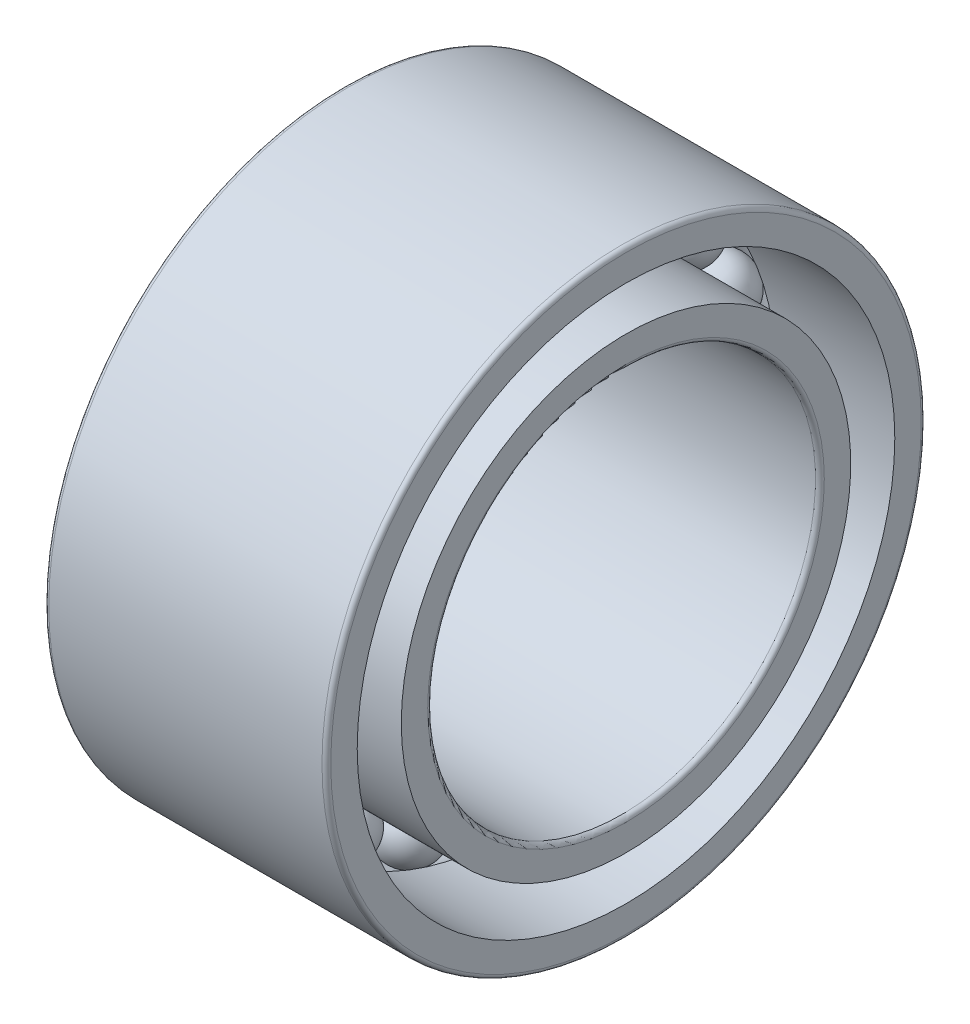
ISO-10303-21;
HEADER;
FILE_DESCRIPTION(('STEP AP214'),'2;1');
FILE_NAME('part.step','',(''),(''),'','','');
FILE_SCHEMA(('AUTOMOTIVE_DESIGN { 1 0 10303 214 1 1 1 1 }'));
ENDSEC;
DATA;
#1=APPLICATION_CONTEXT('core data for automotive mechanical design processes');
#2=APPLICATION_PROTOCOL_DEFINITION('international standard','automotive_design',2000,#1);
#3=PRODUCT_CONTEXT('',#1,'mechanical');
#4=PRODUCT('Part','Part','',(#3));
#5=PRODUCT_RELATED_PRODUCT_CATEGORY('part','',(#4));
#6=PRODUCT_DEFINITION_FORMATION('','',#4);
#7=PRODUCT_DEFINITION_CONTEXT('part definition',#1,'design');
#8=PRODUCT_DEFINITION('design','',#6,#7);
#9=PRODUCT_DEFINITION_SHAPE('','',#8);
#10=(LENGTH_UNIT() NAMED_UNIT(*) SI_UNIT(.MILLI.,.METRE.));
#11=(NAMED_UNIT(*) PLANE_ANGLE_UNIT() SI_UNIT($,.RADIAN.));
#12=(NAMED_UNIT(*) SI_UNIT($,.STERADIAN.) SOLID_ANGLE_UNIT());
#13=UNCERTAINTY_MEASURE_WITH_UNIT(LENGTH_MEASURE(1.E-05),#10,'distance_accuracy_value','');
#14=(GEOMETRIC_REPRESENTATION_CONTEXT(3) GLOBAL_UNCERTAINTY_ASSIGNED_CONTEXT((#13)) GLOBAL_UNIT_ASSIGNED_CONTEXT((#10,
#11,#12)) REPRESENTATION_CONTEXT('',''));
#15=CARTESIAN_POINT('',(0.,0.,0.));
#16=DIRECTION('',(0.,0.,1.));
#17=DIRECTION('',(1.,0.,0.));
#18=AXIS2_PLACEMENT_3D('',#15,#16,#17);
#19=CARTESIAN_POINT('',(0.,13.3147912281322,4.32623792124909));
#20=DIRECTION('',(-1.,0.,0.));
#21=DIRECTION('',(0.,0.951056516295158,0.309016994374935));
#22=AXIS2_PLACEMENT_3D('',#19,#20,#21);
#23=SPHERICAL_SURFACE('',#22,1.75);
#24=CARTESIAN_POINT('',(-1.75,13.3147912281322,4.32623792124909));
#25=VERTEX_POINT('',#24);
#26=VERTEX_LOOP('',#25);
#27=FACE_BOUND('',#26,.T.);
#28=ADVANCED_FACE('F48',(#27),#23,.T.);
#29=CLOSED_SHELL('',(#28));
#30=MANIFOLD_SOLID_BREP('B2',#29);
#31=CARTESIAN_POINT('',(0.,11.3262379212494,8.22899353209447));
#32=DIRECTION('',(-1.,0.,0.));
#33=DIRECTION('',(0.,0.809016994374955,0.587785252292462));
#34=AXIS2_PLACEMENT_3D('',#31,#32,#33);
#35=SPHERICAL_SURFACE('',#34,1.75);
#36=CARTESIAN_POINT('',(-1.75,11.3262379212494,8.22899353209447));
#37=VERTEX_POINT('',#36);
#38=VERTEX_LOOP('',#37);
#39=FACE_BOUND('',#38,.T.);
#40=ADVANCED_FACE('F69',(#39),#35,.T.);
#41=CLOSED_SHELL('',(#40));
#42=MANIFOLD_SOLID_BREP('B6',#41);
#43=CARTESIAN_POINT('',(0.,8.22899353209476,11.3262379212492));
#44=DIRECTION('',(-1.,0.,0.));
#45=DIRECTION('',(0.,0.587785252292483,0.80901699437494));
#46=AXIS2_PLACEMENT_3D('',#43,#44,#45);
#47=SPHERICAL_SURFACE('',#46,1.75);
#48=CARTESIAN_POINT('',(-1.75,8.22899353209476,11.3262379212492));
#49=VERTEX_POINT('',#48);
#50=VERTEX_LOOP('',#49);
#51=FACE_BOUND('',#50,.T.);
#52=ADVANCED_FACE('F90',(#51),#47,.T.);
#53=CLOSED_SHELL('',(#52));
#54=MANIFOLD_SOLID_BREP('B44',#53);
#55=CARTESIAN_POINT('',(0.,4.32623792124942,13.3147912281321));
#56=DIRECTION('',(-1.,0.,0.));
#57=DIRECTION('',(0.,0.309016994374958,0.95105651629515));
#58=AXIS2_PLACEMENT_3D('',#55,#56,#57);
#59=SPHERICAL_SURFACE('',#58,1.75);
#60=CARTESIAN_POINT('',(-1.75,4.32623792124942,13.3147912281321));
#61=VERTEX_POINT('',#60);
#62=VERTEX_LOOP('',#61);
#63=FACE_BOUND('',#62,.T.);
#64=ADVANCED_FACE('F111',(#63),#59,.T.);
#65=CLOSED_SHELL('',(#64));
#66=MANIFOLD_SOLID_BREP('B65',#65);
#67=CARTESIAN_POINT('',(0.,1.46642216231412E-13,14.));
#68=DIRECTION('',(-1.,0.,0.));
#69=DIRECTION('',(0.,0.,1.));
#70=AXIS2_PLACEMENT_3D('',#67,#68,#69);
#71=SPHERICAL_SURFACE('',#70,1.75);
#72=CARTESIAN_POINT('',(-1.75,1.46642216231412E-13,14.));
#73=VERTEX_POINT('',#72);
#74=VERTEX_LOOP('',#73);
#75=FACE_BOUND('',#74,.T.);
#76=ADVANCED_FACE('F132',(#75),#71,.T.);
#77=CLOSED_SHELL('',(#76));
#78=MANIFOLD_SOLID_BREP('B86',#77);
#79=CARTESIAN_POINT('',(0.,-4.32623792124914,13.3147912281322));
#80=DIRECTION('',(-1.,0.,0.));
#81=DIRECTION('',(0.,-0.309016994374938,0.951056516295157));
#82=AXIS2_PLACEMENT_3D('',#79,#80,#81);
#83=SPHERICAL_SURFACE('',#82,1.75);
#84=CARTESIAN_POINT('',(-1.75,-4.32623792124914,13.3147912281322));
#85=VERTEX_POINT('',#84);
#86=VERTEX_LOOP('',#85);
#87=FACE_BOUND('',#86,.T.);
#88=ADVANCED_FACE('F153',(#87),#83,.T.);
#89=CLOSED_SHELL('',(#88));
#90=MANIFOLD_SOLID_BREP('B107',#89);
#91=CARTESIAN_POINT('',(0.,-8.22899353209452,11.3262379212493));
#92=DIRECTION('',(-1.,0.,0.));
#93=DIRECTION('',(0.,-0.587785252292465,0.809016994374953));
#94=AXIS2_PLACEMENT_3D('',#91,#92,#93);
#95=SPHERICAL_SURFACE('',#94,1.75);
#96=CARTESIAN_POINT('',(-1.75,-8.22899353209452,11.3262379212493));
#97=VERTEX_POINT('',#96);
#98=VERTEX_LOOP('',#97);
#99=FACE_BOUND('',#98,.T.);
#100=ADVANCED_FACE('F174',(#99),#95,.T.);
#101=CLOSED_SHELL('',(#100));
#102=MANIFOLD_SOLID_BREP('B128',#101);
#103=CARTESIAN_POINT('',(0.,-11.3262379212492,8.22899353209472));
#104=DIRECTION('',(-1.,0.,0.));
#105=DIRECTION('',(0.,-0.809016994374942,0.58778525229248));
#106=AXIS2_PLACEMENT_3D('',#103,#104,#105);
#107=SPHERICAL_SURFACE('',#106,1.75);
#108=CARTESIAN_POINT('',(-1.75,-11.3262379212492,8.22899353209472));
#109=VERTEX_POINT('',#108);
#110=VERTEX_LOOP('',#109);
#111=FACE_BOUND('',#110,.T.);
#112=ADVANCED_FACE('F195',(#111),#107,.T.);
#113=CLOSED_SHELL('',(#112));
#114=MANIFOLD_SOLID_BREP('B149',#113);
#115=CARTESIAN_POINT('',(0.,-13.3147912281321,4.32623792124937));
#116=DIRECTION('',(-1.,0.,0.));
#117=DIRECTION('',(0.,-0.951056516295151,0.309016994374955));
#118=AXIS2_PLACEMENT_3D('',#115,#116,#117);
#119=SPHERICAL_SURFACE('',#118,1.75);
#120=CARTESIAN_POINT('',(-1.75,-13.3147912281321,4.32623792124937));
#121=VERTEX_POINT('',#120);
#122=VERTEX_LOOP('',#121);
#123=FACE_BOUND('',#122,.T.);
#124=ADVANCED_FACE('F216',(#123),#119,.T.);
#125=CLOSED_SHELL('',(#124));
#126=MANIFOLD_SOLID_BREP('B170',#125);
#127=CARTESIAN_POINT('',(0.,-14.,0.));
#128=DIRECTION('',(-1.,0.,0.));
#129=DIRECTION('',(0.,-1.,0.));
#130=AXIS2_PLACEMENT_3D('',#127,#128,#129);
#131=SPHERICAL_SURFACE('',#130,1.75);
#132=CARTESIAN_POINT('',(-1.75,-14.,0.));
#133=VERTEX_POINT('',#132);
#134=VERTEX_LOOP('',#133);
#135=FACE_BOUND('',#134,.T.);
#136=ADVANCED_FACE('F237',(#135),#131,.T.);
#137=CLOSED_SHELL('',(#136));
#138=MANIFOLD_SOLID_BREP('B191',#137);
#139=CARTESIAN_POINT('',(0.,-13.3147912281322,-4.32623792124918));
#140=DIRECTION('',(-1.,0.,0.));
#141=DIRECTION('',(0.,-0.951056516295156,-0.309016994374941));
#142=AXIS2_PLACEMENT_3D('',#139,#140,#141);
#143=SPHERICAL_SURFACE('',#142,1.75);
#144=CARTESIAN_POINT('',(-1.75,-13.3147912281322,-4.32623792124918));
#145=VERTEX_POINT('',#144);
#146=VERTEX_LOOP('',#145);
#147=FACE_BOUND('',#146,.T.);
#148=ADVANCED_FACE('F258',(#147),#143,.T.);
#149=CLOSED_SHELL('',(#148));
#150=MANIFOLD_SOLID_BREP('B212',#149);
#151=CARTESIAN_POINT('',(0.,-11.3262379212493,-8.22899353209456));
#152=DIRECTION('',(-1.,0.,0.));
#153=DIRECTION('',(0.,-0.809016994374951,-0.587785252292469));
#154=AXIS2_PLACEMENT_3D('',#151,#152,#153);
#155=SPHERICAL_SURFACE('',#154,1.75);
#156=CARTESIAN_POINT('',(-1.75,-11.3262379212493,-8.22899353209456));
#157=VERTEX_POINT('',#156);
#158=VERTEX_LOOP('',#157);
#159=FACE_BOUND('',#158,.T.);
#160=ADVANCED_FACE('F279',(#159),#155,.T.);
#161=CLOSED_SHELL('',(#160));
#162=MANIFOLD_SOLID_BREP('B233',#161);
#163=CARTESIAN_POINT('',(0.,-8.22899353209468,-11.3262379212492));
#164=DIRECTION('',(-1.,0.,0.));
#165=DIRECTION('',(0.,-0.587785252292477,-0.809016994374945));
#166=AXIS2_PLACEMENT_3D('',#163,#164,#165);
#167=SPHERICAL_SURFACE('',#166,1.75);
#168=CARTESIAN_POINT('',(-1.75,-8.22899353209468,-11.3262379212492));
#169=VERTEX_POINT('',#168);
#170=VERTEX_LOOP('',#169);
#171=FACE_BOUND('',#170,.T.);
#172=ADVANCED_FACE('F300',(#171),#167,.T.);
#173=CLOSED_SHELL('',(#172));
#174=MANIFOLD_SOLID_BREP('B254',#173);
#175=CARTESIAN_POINT('',(0.,-4.32623792124932,-13.3147912281321));
#176=DIRECTION('',(-1.,0.,0.));
#177=DIRECTION('',(0.,-0.309016994374952,-0.951056516295152));
#178=AXIS2_PLACEMENT_3D('',#175,#176,#177);
#179=SPHERICAL_SURFACE('',#178,1.75);
#180=CARTESIAN_POINT('',(-1.75,-4.32623792124932,-13.3147912281321));
#181=VERTEX_POINT('',#180);
#182=VERTEX_LOOP('',#181);
#183=FACE_BOUND('',#182,.T.);
#184=ADVANCED_FACE('F321',(#183),#179,.T.);
#185=CLOSED_SHELL('',(#184));
#186=MANIFOLD_SOLID_BREP('B275',#185);
#187=CARTESIAN_POINT('',(0.,0.,-14.));
#188=DIRECTION('',(-1.,0.,0.));
#189=DIRECTION('',(0.,0.,-1.));
#190=AXIS2_PLACEMENT_3D('',#187,#188,#189);
#191=SPHERICAL_SURFACE('',#190,1.75);
#192=CARTESIAN_POINT('',(-1.75,0.,-14.));
#193=VERTEX_POINT('',#192);
#194=VERTEX_LOOP('',#193);
#195=FACE_BOUND('',#194,.T.);
#196=ADVANCED_FACE('F342',(#195),#191,.T.);
#197=CLOSED_SHELL('',(#196));
#198=MANIFOLD_SOLID_BREP('B296',#197);
#199=CARTESIAN_POINT('',(0.,4.32623792124923,-13.3147912281322));
#200=DIRECTION('',(-1.,0.,0.));
#201=DIRECTION('',(0.,0.309016994374945,-0.951056516295155));
#202=AXIS2_PLACEMENT_3D('',#199,#200,#201);
#203=SPHERICAL_SURFACE('',#202,1.75);
#204=CARTESIAN_POINT('',(-1.75,4.32623792124923,-13.3147912281322));
#205=VERTEX_POINT('',#204);
#206=VERTEX_LOOP('',#205);
#207=FACE_BOUND('',#206,.T.);
#208=ADVANCED_FACE('F363',(#207),#203,.T.);
#209=CLOSED_SHELL('',(#208));
#210=MANIFOLD_SOLID_BREP('B317',#209);
#211=CARTESIAN_POINT('',(0.,8.2289935320946,-11.3262379212493));
#212=DIRECTION('',(-1.,0.,0.));
#213=DIRECTION('',(0.,0.587785252292471,-0.809016994374949));
#214=AXIS2_PLACEMENT_3D('',#211,#212,#213);
#215=SPHERICAL_SURFACE('',#214,1.75);
#216=CARTESIAN_POINT('',(-1.75,8.2289935320946,-11.3262379212493));
#217=VERTEX_POINT('',#216);
#218=VERTEX_LOOP('',#217);
#219=FACE_BOUND('',#218,.T.);
#220=ADVANCED_FACE('F384',(#219),#215,.T.);
#221=CLOSED_SHELL('',(#220));
#222=MANIFOLD_SOLID_BREP('B338',#221);
#223=CARTESIAN_POINT('',(0.,11.3262379212493,-8.22899353209464));
#224=DIRECTION('',(-1.,0.,0.));
#225=DIRECTION('',(0.,0.809016994374947,-0.587785252292474));
#226=AXIS2_PLACEMENT_3D('',#223,#224,#225);
#227=SPHERICAL_SURFACE('',#226,1.75);
#228=CARTESIAN_POINT('',(-1.75,11.3262379212493,-8.22899353209464));
#229=VERTEX_POINT('',#228);
#230=VERTEX_LOOP('',#229);
#231=FACE_BOUND('',#230,.T.);
#232=ADVANCED_FACE('F405',(#231),#227,.T.);
#233=CLOSED_SHELL('',(#232));
#234=MANIFOLD_SOLID_BREP('B359',#233);
#235=CARTESIAN_POINT('',(0.,13.3147912281321,-4.32623792124927));
#236=DIRECTION('',(-1.,0.,0.));
#237=DIRECTION('',(0.,0.951056516295154,-0.309016994374948));
#238=AXIS2_PLACEMENT_3D('',#235,#236,#237);
#239=SPHERICAL_SURFACE('',#238,1.75);
#240=CARTESIAN_POINT('',(-1.75,13.3147912281321,-4.32623792124927));
#241=VERTEX_POINT('',#240);
#242=VERTEX_LOOP('',#241);
#243=FACE_BOUND('',#242,.T.);
#244=ADVANCED_FACE('F426',(#243),#239,.T.);
#245=CLOSED_SHELL('',(#244));
#246=MANIFOLD_SOLID_BREP('B380',#245);
#247=CARTESIAN_POINT('',(0.,14.,0.));
#248=DIRECTION('',(-1.,0.,0.));
#249=DIRECTION('',(0.,1.,0.));
#250=AXIS2_PLACEMENT_3D('',#247,#248,#249);
#251=SPHERICAL_SURFACE('',#250,1.75);
#252=CARTESIAN_POINT('',(-1.75,14.,0.));
#253=VERTEX_POINT('',#252);
#254=VERTEX_LOOP('',#253);
#255=FACE_BOUND('',#254,.T.);
#256=ADVANCED_FACE('F449',(#255),#251,.T.);
#257=CLOSED_SHELL('',(#256));
#258=MANIFOLD_SOLID_BREP('B401',#257);
#259=CARTESIAN_POINT('',(-7.75,0.,0.));
#260=DIRECTION('',(-1.,0.,0.));
#261=DIRECTION('',(0.,0.,1.));
#262=AXIS2_PLACEMENT_3D('',#259,#260,#261);
#263=TOROIDAL_SURFACE('',#262,11.25,0.250000000000006);
#264=CARTESIAN_POINT('',(-7.75,0.,0.));
#265=DIRECTION('',(-1.,0.,0.));
#266=DIRECTION('',(0.,0.,1.));
#267=AXIS2_PLACEMENT_3D('',#264,#265,#266);
#268=CIRCLE('',#267,11.);
#269=CARTESIAN_POINT('',(-7.75,0.,11.));
#270=VERTEX_POINT('',#269);
#271=EDGE_CURVE('E499',#270,#270,#268,.T.);
#272=ORIENTED_EDGE('',*,*,#271,.F.);
#273=EDGE_LOOP('',(#272));
#274=FACE_BOUND('',#273,.T.);
#275=CARTESIAN_POINT('',(-8.,0.,0.));
#276=DIRECTION('',(-1.,0.,0.));
#277=DIRECTION('',(0.,0.,1.));
#278=AXIS2_PLACEMENT_3D('',#275,#276,#277);
#279=CIRCLE('',#278,11.25);
#280=CARTESIAN_POINT('',(-8.,0.,11.25));
#281=VERTEX_POINT('',#280);
#282=EDGE_CURVE('E448',#281,#281,#279,.T.);
#283=ORIENTED_EDGE('',*,*,#282,.T.);
#284=EDGE_LOOP('',(#283));
#285=FACE_BOUND('',#284,.T.);
#286=ADVANCED_FACE('F471',(#274,#285),#263,.T.);
#287=CARTESIAN_POINT('',(-8.,11.25,0.));
#288=DIRECTION('',(1.,0.,0.));
#289=DIRECTION('',(0.,0.,-1.));
#290=AXIS2_PLACEMENT_3D('',#287,#288,#289);
#291=PLANE('',#290);
#292=ORIENTED_EDGE('',*,*,#282,.F.);
#293=EDGE_LOOP('',(#292));
#294=FACE_BOUND('',#293,.T.);
#295=CARTESIAN_POINT('',(-8.,0.,0.));
#296=DIRECTION('',(-1.,0.,0.));
#297=DIRECTION('',(0.,0.,1.));
#298=AXIS2_PLACEMENT_3D('',#295,#296,#297);
#299=CIRCLE('',#298,12.75);
#300=CARTESIAN_POINT('',(-8.,0.,12.75));
#301=VERTEX_POINT('',#300);
#302=EDGE_CURVE('E477',#301,#301,#299,.T.);
#303=ORIENTED_EDGE('',*,*,#302,.T.);
#304=EDGE_LOOP('',(#303));
#305=FACE_BOUND('',#304,.T.);
#306=ADVANCED_FACE('F506',(#294,#305),#291,.F.);
#307=CARTESIAN_POINT('',(0.,0.,0.));
#308=DIRECTION('',(-1.,0.,0.));
#309=DIRECTION('',(0.,0.,1.));
#310=AXIS2_PLACEMENT_3D('',#307,#308,#309);
#311=CYLINDRICAL_SURFACE('',#310,12.75);
#312=ORIENTED_EDGE('',*,*,#302,.F.);
#313=EDGE_LOOP('',(#312));
#314=FACE_BOUND('',#313,.T.);
#315=CARTESIAN_POINT('',(-1.22474487139159,0.,0.));
#316=DIRECTION('',(-1.,0.,0.));
#317=DIRECTION('',(0.,0.,1.));
#318=AXIS2_PLACEMENT_3D('',#315,#316,#317);
#319=CIRCLE('',#318,12.75);
#320=CARTESIAN_POINT('',(-1.22474487139159,0.,12.75));
#321=VERTEX_POINT('',#320);
#322=EDGE_CURVE('E481',#321,#321,#319,.T.);
#323=ORIENTED_EDGE('',*,*,#322,.T.);
#324=EDGE_LOOP('',(#323));
#325=FACE_BOUND('',#324,.T.);
#326=ADVANCED_FACE('F510',(#314,#325),#311,.T.);
#327=CARTESIAN_POINT('',(0.,0.,0.));
#328=DIRECTION('',(-1.,0.,0.));
#329=DIRECTION('',(0.,0.,1.));
#330=AXIS2_PLACEMENT_3D('',#327,#328,#329);
#331=TOROIDAL_SURFACE('',#330,14.,1.75);
#332=ORIENTED_EDGE('',*,*,#322,.F.);
#333=EDGE_LOOP('',(#332));
#334=FACE_BOUND('',#333,.T.);
#335=CARTESIAN_POINT('',(1.22474487139159,0.,0.));
#336=DIRECTION('',(-1.,0.,0.));
#337=DIRECTION('',(0.,0.,1.));
#338=AXIS2_PLACEMENT_3D('',#335,#336,#337);
#339=CIRCLE('',#338,12.75);
#340=CARTESIAN_POINT('',(1.22474487139159,0.,12.75));
#341=VERTEX_POINT('',#340);
#342=EDGE_CURVE('E485',#341,#341,#339,.T.);
#343=ORIENTED_EDGE('',*,*,#342,.T.);
#344=EDGE_LOOP('',(#343));
#345=FACE_BOUND('',#344,.T.);
#346=ADVANCED_FACE('F515',(#334,#345),#331,.F.);
#347=CARTESIAN_POINT('',(0.,0.,0.));
#348=DIRECTION('',(-1.,0.,0.));
#349=DIRECTION('',(0.,0.,1.));
#350=AXIS2_PLACEMENT_3D('',#347,#348,#349);
#351=CYLINDRICAL_SURFACE('',#350,12.75);
#352=ORIENTED_EDGE('',*,*,#342,.F.);
#353=EDGE_LOOP('',(#352));
#354=FACE_BOUND('',#353,.T.);
#355=CARTESIAN_POINT('',(8.,0.,0.));
#356=DIRECTION('',(-1.,0.,0.));
#357=DIRECTION('',(0.,0.,1.));
#358=AXIS2_PLACEMENT_3D('',#355,#356,#357);
#359=CIRCLE('',#358,12.75);
#360=CARTESIAN_POINT('',(8.,0.,12.75));
#361=VERTEX_POINT('',#360);
#362=EDGE_CURVE('E490',#361,#361,#359,.T.);
#363=ORIENTED_EDGE('',*,*,#362,.T.);
#364=EDGE_LOOP('',(#363));
#365=FACE_BOUND('',#364,.T.);
#366=ADVANCED_FACE('F521',(#354,#365),#351,.T.);
#367=CARTESIAN_POINT('',(8.,12.75,0.));
#368=DIRECTION('',(-1.,0.,0.));
#369=DIRECTION('',(0.,0.,1.));
#370=AXIS2_PLACEMENT_3D('',#367,#368,#369);
#371=PLANE('',#370);
#372=ORIENTED_EDGE('',*,*,#362,.F.);
#373=EDGE_LOOP('',(#372));
#374=FACE_BOUND('',#373,.T.);
#375=CARTESIAN_POINT('',(8.00000000000001,0.,0.));
#376=DIRECTION('',(-1.,0.,0.));
#377=DIRECTION('',(0.,0.,1.));
#378=AXIS2_PLACEMENT_3D('',#375,#376,#377);
#379=CIRCLE('',#378,11.25);
#380=CARTESIAN_POINT('',(8.00000000000001,0.,11.25));
#381=VERTEX_POINT('',#380);
#382=EDGE_CURVE('E493',#381,#381,#379,.T.);
#383=ORIENTED_EDGE('',*,*,#382,.T.);
#384=EDGE_LOOP('',(#383));
#385=FACE_BOUND('',#384,.T.);
#386=ADVANCED_FACE('F525',(#374,#385),#371,.F.);
#387=CARTESIAN_POINT('',(7.75,0.,0.));
#388=DIRECTION('',(-1.,0.,0.));
#389=DIRECTION('',(0.,0.,1.));
#390=AXIS2_PLACEMENT_3D('',#387,#388,#389);
#391=TOROIDAL_SURFACE('',#390,11.25,0.250000000000004);
#392=ORIENTED_EDGE('',*,*,#382,.F.);
#393=EDGE_LOOP('',(#392));
#394=FACE_BOUND('',#393,.T.);
#395=CARTESIAN_POINT('',(7.75,0.,0.));
#396=DIRECTION('',(-1.,0.,0.));
#397=DIRECTION('',(0.,0.,1.));
#398=AXIS2_PLACEMENT_3D('',#395,#396,#397);
#399=CIRCLE('',#398,11.);
#400=CARTESIAN_POINT('',(7.75,0.,11.));
#401=VERTEX_POINT('',#400);
#402=EDGE_CURVE('E496',#401,#401,#399,.T.);
#403=ORIENTED_EDGE('',*,*,#402,.T.);
#404=EDGE_LOOP('',(#403));
#405=FACE_BOUND('',#404,.T.);
#406=ADVANCED_FACE('F529',(#394,#405),#391,.T.);
#407=CARTESIAN_POINT('',(0.,0.,0.));
#408=DIRECTION('',(-1.,0.,0.));
#409=DIRECTION('',(0.,0.,1.));
#410=AXIS2_PLACEMENT_3D('',#407,#408,#409);
#411=CYLINDRICAL_SURFACE('',#410,11.);
#412=ORIENTED_EDGE('',*,*,#402,.F.);
#413=EDGE_LOOP('',(#412));
#414=FACE_BOUND('',#413,.T.);
#415=ORIENTED_EDGE('',*,*,#271,.T.);
#416=EDGE_LOOP('',(#415));
#417=FACE_BOUND('',#416,.T.);
#418=ADVANCED_FACE('F503',(#414,#417),#411,.F.);
#419=CLOSED_SHELL('',(#286,#306,#326,#346,#366,#386,#406,#418));
#420=MANIFOLD_SOLID_BREP('B422',#419);
#421=CARTESIAN_POINT('',(0.,0.,0.));
#422=DIRECTION('',(-1.,0.,0.));
#423=DIRECTION('',(0.,0.,1.));
#424=AXIS2_PLACEMENT_3D('',#421,#422,#423);
#425=CYLINDRICAL_SURFACE('',#424,15.25);
#426=CARTESIAN_POINT('',(-1.22474487139159,0.,0.));
#427=DIRECTION('',(-1.,0.,0.));
#428=DIRECTION('',(0.,0.,1.));
#429=AXIS2_PLACEMENT_3D('',#426,#427,#428);
#430=CIRCLE('',#429,15.25);
#431=CARTESIAN_POINT('',(-1.22474487139159,0.,15.25));
#432=VERTEX_POINT('',#431);
#433=EDGE_CURVE('E644',#432,#432,#430,.T.);
#434=ORIENTED_EDGE('',*,*,#433,.F.);
#435=EDGE_LOOP('',(#434));
#436=FACE_BOUND('',#435,.T.);
#437=CARTESIAN_POINT('',(-8.,0.,0.));
#438=DIRECTION('',(-1.,0.,0.));
#439=DIRECTION('',(0.,0.,1.));
#440=AXIS2_PLACEMENT_3D('',#437,#438,#439);
#441=CIRCLE('',#440,15.25);
#442=CARTESIAN_POINT('',(-8.,0.,15.25));
#443=VERTEX_POINT('',#442);
#444=EDGE_CURVE('E470',#443,#443,#441,.T.);
#445=ORIENTED_EDGE('',*,*,#444,.T.);
#446=EDGE_LOOP('',(#445));
#447=FACE_BOUND('',#446,.T.);
#448=ADVANCED_FACE('F609',(#436,#447),#425,.F.);
#449=CARTESIAN_POINT('',(-8.,16.75,0.));
#450=DIRECTION('',(1.,0.,0.));
#451=DIRECTION('',(0.,0.,-1.));
#452=AXIS2_PLACEMENT_3D('',#449,#450,#451);
#453=PLANE('',#452);
#454=ORIENTED_EDGE('',*,*,#444,.F.);
#455=EDGE_LOOP('',(#454));
#456=FACE_BOUND('',#455,.T.);
#457=CARTESIAN_POINT('',(-8.,0.,0.));
#458=DIRECTION('',(-1.,0.,0.));
#459=DIRECTION('',(0.,0.,1.));
#460=AXIS2_PLACEMENT_3D('',#457,#458,#459);
#461=CIRCLE('',#460,16.75);
#462=CARTESIAN_POINT('',(-8.,0.,16.75));
#463=VERTEX_POINT('',#462);
#464=EDGE_CURVE('E616',#463,#463,#461,.T.);
#465=ORIENTED_EDGE('',*,*,#464,.T.);
#466=EDGE_LOOP('',(#465));
#467=FACE_BOUND('',#466,.T.);
#468=ADVANCED_FACE('F652',(#456,#467),#453,.F.);
#469=CARTESIAN_POINT('',(-7.75,0.,0.));
#470=DIRECTION('',(-1.,0.,0.));
#471=DIRECTION('',(0.,0.,1.));
#472=AXIS2_PLACEMENT_3D('',#469,#470,#471);
#473=TOROIDAL_SURFACE('',#472,16.75,0.250000000000005);
#474=ORIENTED_EDGE('',*,*,#464,.F.);
#475=EDGE_LOOP('',(#474));
#476=FACE_BOUND('',#475,.T.);
#477=CARTESIAN_POINT('',(-7.75,0.,0.));
#478=DIRECTION('',(-1.,0.,0.));
#479=DIRECTION('',(0.,0.,1.));
#480=AXIS2_PLACEMENT_3D('',#477,#478,#479);
#481=CIRCLE('',#480,17.);
#482=CARTESIAN_POINT('',(-7.75,0.,17.));
#483=VERTEX_POINT('',#482);
#484=EDGE_CURVE('E621',#483,#483,#481,.T.);
#485=ORIENTED_EDGE('',*,*,#484,.T.);
#486=EDGE_LOOP('',(#485));
#487=FACE_BOUND('',#486,.T.);
#488=ADVANCED_FACE('F656',(#476,#487),#473,.T.);
#489=CARTESIAN_POINT('',(0.,0.,0.));
#490=DIRECTION('',(-1.,0.,0.));
#491=DIRECTION('',(0.,0.,1.));
#492=AXIS2_PLACEMENT_3D('',#489,#490,#491);
#493=CYLINDRICAL_SURFACE('',#492,17.);
#494=ORIENTED_EDGE('',*,*,#484,.F.);
#495=EDGE_LOOP('',(#494));
#496=FACE_BOUND('',#495,.T.);
#497=CARTESIAN_POINT('',(7.75,0.,0.));
#498=DIRECTION('',(-1.,0.,0.));
#499=DIRECTION('',(0.,0.,1.));
#500=AXIS2_PLACEMENT_3D('',#497,#498,#499);
#501=CIRCLE('',#500,17.);
#502=CARTESIAN_POINT('',(7.75,0.,17.));
#503=VERTEX_POINT('',#502);
#504=EDGE_CURVE('E626',#503,#503,#501,.T.);
#505=ORIENTED_EDGE('',*,*,#504,.T.);
#506=EDGE_LOOP('',(#505));
#507=FACE_BOUND('',#506,.T.);
#508=ADVANCED_FACE('F661',(#496,#507),#493,.T.);
#509=CARTESIAN_POINT('',(7.75,0.,0.));
#510=DIRECTION('',(-1.,0.,0.));
#511=DIRECTION('',(0.,0.,1.));
#512=AXIS2_PLACEMENT_3D('',#509,#510,#511);
#513=TOROIDAL_SURFACE('',#512,16.75,0.250000000000005);
#514=ORIENTED_EDGE('',*,*,#504,.F.);
#515=EDGE_LOOP('',(#514));
#516=FACE_BOUND('',#515,.T.);
#517=CARTESIAN_POINT('',(8.,0.,0.));
#518=DIRECTION('',(-1.,0.,0.));
#519=DIRECTION('',(0.,0.,1.));
#520=AXIS2_PLACEMENT_3D('',#517,#518,#519);
#521=CIRCLE('',#520,16.75);
#522=CARTESIAN_POINT('',(8.,0.,16.75));
#523=VERTEX_POINT('',#522);
#524=EDGE_CURVE('E632',#523,#523,#521,.T.);
#525=ORIENTED_EDGE('',*,*,#524,.T.);
#526=EDGE_LOOP('',(#525));
#527=FACE_BOUND('',#526,.T.);
#528=ADVANCED_FACE('F667',(#516,#527),#513,.T.);
#529=CARTESIAN_POINT('',(8.,15.25,0.));
#530=DIRECTION('',(-1.,0.,0.));
#531=DIRECTION('',(0.,0.,1.));
#532=AXIS2_PLACEMENT_3D('',#529,#530,#531);
#533=PLANE('',#532);
#534=ORIENTED_EDGE('',*,*,#524,.F.);
#535=EDGE_LOOP('',(#534));
#536=FACE_BOUND('',#535,.T.);
#537=CARTESIAN_POINT('',(8.,0.,0.));
#538=DIRECTION('',(-1.,0.,0.));
#539=DIRECTION('',(0.,0.,1.));
#540=AXIS2_PLACEMENT_3D('',#537,#538,#539);
#541=CIRCLE('',#540,15.25);
#542=CARTESIAN_POINT('',(8.,0.,15.25));
#543=VERTEX_POINT('',#542);
#544=EDGE_CURVE('E636',#543,#543,#541,.T.);
#545=ORIENTED_EDGE('',*,*,#544,.T.);
#546=EDGE_LOOP('',(#545));
#547=FACE_BOUND('',#546,.T.);
#548=ADVANCED_FACE('F671',(#536,#547),#533,.F.);
#549=CARTESIAN_POINT('',(0.,0.,0.));
#550=DIRECTION('',(-1.,0.,0.));
#551=DIRECTION('',(0.,0.,1.));
#552=AXIS2_PLACEMENT_3D('',#549,#550,#551);
#553=CYLINDRICAL_SURFACE('',#552,15.25);
#554=ORIENTED_EDGE('',*,*,#544,.F.);
#555=EDGE_LOOP('',(#554));
#556=FACE_BOUND('',#555,.T.);
#557=CARTESIAN_POINT('',(1.22474487139159,0.,0.));
#558=DIRECTION('',(-1.,0.,0.));
#559=DIRECTION('',(0.,0.,1.));
#560=AXIS2_PLACEMENT_3D('',#557,#558,#559);
#561=CIRCLE('',#560,15.25);
#562=CARTESIAN_POINT('',(1.22474487139159,0.,15.25));
#563=VERTEX_POINT('',#562);
#564=EDGE_CURVE('E640',#563,#563,#561,.T.);
#565=ORIENTED_EDGE('',*,*,#564,.T.);
#566=EDGE_LOOP('',(#565));
#567=FACE_BOUND('',#566,.T.);
#568=ADVANCED_FACE('F675',(#556,#567),#553,.F.);
#569=CARTESIAN_POINT('',(0.,0.,0.));
#570=DIRECTION('',(-1.,0.,0.));
#571=DIRECTION('',(0.,0.,1.));
#572=AXIS2_PLACEMENT_3D('',#569,#570,#571);
#573=TOROIDAL_SURFACE('',#572,14.,1.75);
#574=ORIENTED_EDGE('',*,*,#564,.F.);
#575=EDGE_LOOP('',(#574));
#576=FACE_BOUND('',#575,.T.);
#577=ORIENTED_EDGE('',*,*,#433,.T.);
#578=EDGE_LOOP('',(#577));
#579=FACE_BOUND('',#578,.T.);
#580=ADVANCED_FACE('F649',(#576,#579),#573,.F.);
#581=CLOSED_SHELL('',(#448,#468,#488,#508,#528,#548,#568,#580));
#582=MANIFOLD_SOLID_BREP('B443',#581);
#583=ADVANCED_BREP_SHAPE_REPRESENTATION('',(#18,#30,#42,#54,#66,#78,#90,#102,#114,#126,#138,
#150,#162,#174,#186,#198,#210,#222,#234,#246,#258,#420,#582),#14);
#584=SHAPE_DEFINITION_REPRESENTATION(#9,#583);
ENDSEC;
END-ISO-10303-21;
